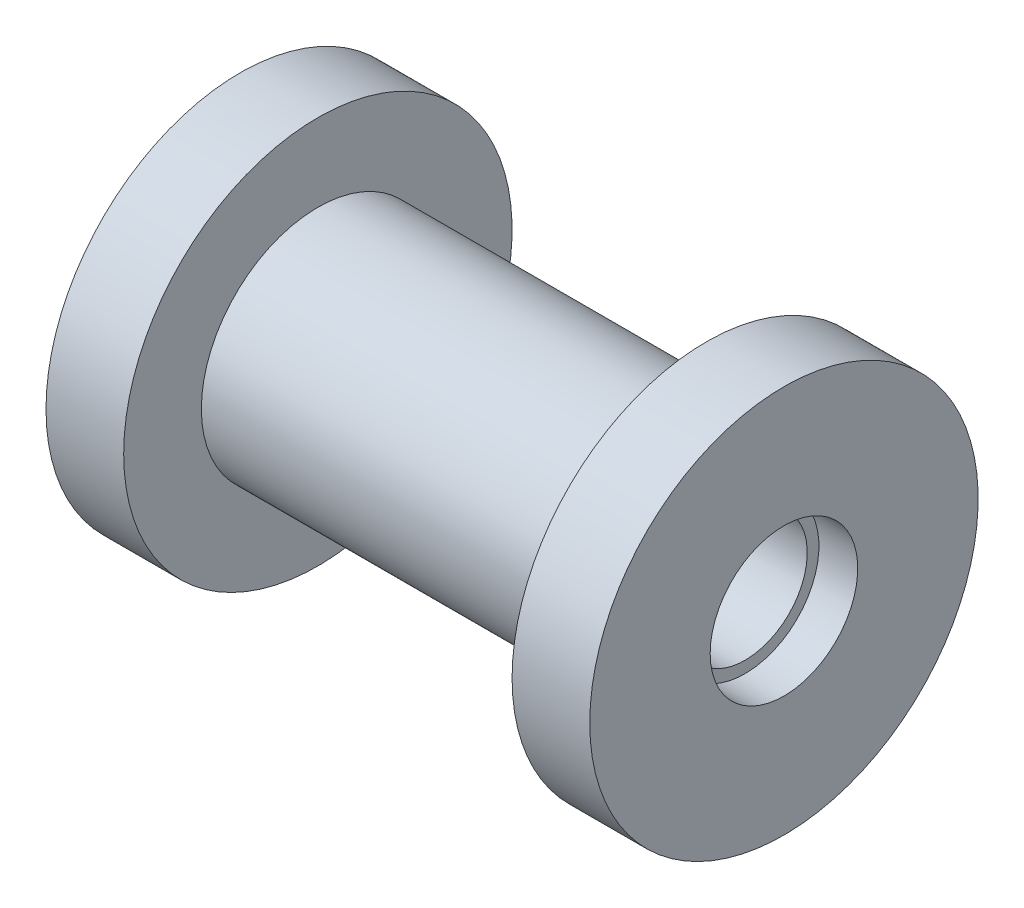
ISO-10303-21;
HEADER;
FILE_DESCRIPTION(('STEP AP214'),'2;1');
FILE_NAME('part.step','',(''),(''),'','','');
FILE_SCHEMA(('AUTOMOTIVE_DESIGN { 1 0 10303 214 1 1 1 1 }'));
ENDSEC;
DATA;
#1=APPLICATION_CONTEXT('core data for automotive mechanical design processes');
#2=APPLICATION_PROTOCOL_DEFINITION('international standard','automotive_design',2000,#1);
#3=PRODUCT_CONTEXT('',#1,'mechanical');
#4=PRODUCT('Part','Part','',(#3));
#5=PRODUCT_RELATED_PRODUCT_CATEGORY('part','',(#4));
#6=PRODUCT_DEFINITION_FORMATION('','',#4);
#7=PRODUCT_DEFINITION_CONTEXT('part definition',#1,'design');
#8=PRODUCT_DEFINITION('design','',#6,#7);
#9=PRODUCT_DEFINITION_SHAPE('','',#8);
#10=(LENGTH_UNIT() NAMED_UNIT(*) SI_UNIT(.MILLI.,.METRE.));
#11=(NAMED_UNIT(*) PLANE_ANGLE_UNIT() SI_UNIT($,.RADIAN.));
#12=(NAMED_UNIT(*) SI_UNIT($,.STERADIAN.) SOLID_ANGLE_UNIT());
#13=UNCERTAINTY_MEASURE_WITH_UNIT(LENGTH_MEASURE(1.E-05),#10,'distance_accuracy_value','');
#14=(GEOMETRIC_REPRESENTATION_CONTEXT(3) GLOBAL_UNCERTAINTY_ASSIGNED_CONTEXT((#13)) GLOBAL_UNIT_ASSIGNED_CONTEXT((#10,
#11,#12)) REPRESENTATION_CONTEXT('',''));
#15=CARTESIAN_POINT('',(0.,0.,0.));
#16=DIRECTION('',(0.,0.,1.));
#17=DIRECTION('',(1.,0.,0.));
#18=AXIS2_PLACEMENT_3D('',#15,#16,#17);
#19=CARTESIAN_POINT('',(5.00000000000001,0.,0.));
#20=DIRECTION('',(1.,0.,0.));
#21=DIRECTION('',(0.,0.,-1.));
#22=AXIS2_PLACEMENT_3D('',#19,#20,#21);
#23=PLANE('',#22);
#24=CARTESIAN_POINT('',(5.,0.,0.));
#25=DIRECTION('',(-1.,0.,0.));
#26=DIRECTION('',(0.,0.,1.));
#27=AXIS2_PLACEMENT_3D('',#24,#25,#26);
#28=CIRCLE('',#27,8.00000000000001);
#29=CARTESIAN_POINT('',(5.,0.,8.00000000000001));
#30=VERTEX_POINT('',#29);
#31=EDGE_CURVE('E10',#30,#30,#28,.T.);
#32=ORIENTED_EDGE('',*,*,#31,.F.);
#33=EDGE_LOOP('',(#32));
#34=FACE_BOUND('',#33,.T.);
#35=CARTESIAN_POINT('',(5.,0.,0.));
#36=DIRECTION('',(-1.,0.,0.));
#37=DIRECTION('',(0.,0.,1.));
#38=AXIS2_PLACEMENT_3D('',#35,#36,#37);
#39=CIRCLE('',#38,9.50000000000001);
#40=CARTESIAN_POINT('',(5.,0.,9.50000000000001));
#41=VERTEX_POINT('',#40);
#42=EDGE_CURVE('E73',#41,#41,#39,.T.);
#43=ORIENTED_EDGE('',*,*,#42,.T.);
#44=EDGE_LOOP('',(#43));
#45=FACE_BOUND('',#44,.T.);
#46=ADVANCED_FACE('F33',(#34,#45),#23,.F.);
#47=CARTESIAN_POINT('',(-69.3943757112314,0.,0.));
#48=DIRECTION('',(-1.,0.,0.));
#49=DIRECTION('',(0.,0.,1.));
#50=AXIS2_PLACEMENT_3D('',#47,#48,#49);
#51=CYLINDRICAL_SURFACE('',#50,8.00000000000001);
#52=CARTESIAN_POINT('',(65.,0.,0.));
#53=DIRECTION('',(-1.,0.,0.));
#54=DIRECTION('',(0.,0.,1.));
#55=AXIS2_PLACEMENT_3D('',#52,#53,#54);
#56=CIRCLE('',#55,8.);
#57=CARTESIAN_POINT('',(65.,0.,8.));
#58=VERTEX_POINT('',#57);
#59=EDGE_CURVE('E39',#58,#58,#56,.T.);
#60=ORIENTED_EDGE('',*,*,#59,.F.);
#61=EDGE_LOOP('',(#60));
#62=FACE_BOUND('',#61,.T.);
#63=ORIENTED_EDGE('',*,*,#31,.T.);
#64=EDGE_LOOP('',(#63));
#65=FACE_BOUND('',#64,.T.);
#66=ADVANCED_FACE('F96',(#62,#65),#51,.F.);
#67=CARTESIAN_POINT('',(65.,0.,0.));
#68=DIRECTION('',(1.,0.,0.));
#69=DIRECTION('',(0.,0.,-1.));
#70=AXIS2_PLACEMENT_3D('',#67,#68,#69);
#71=PLANE('',#70);
#72=ORIENTED_EDGE('',*,*,#59,.T.);
#73=EDGE_LOOP('',(#72));
#74=FACE_BOUND('',#73,.T.);
#75=CARTESIAN_POINT('',(65.,0.,0.));
#76=DIRECTION('',(-1.,0.,0.));
#77=DIRECTION('',(0.,0.,1.));
#78=AXIS2_PLACEMENT_3D('',#75,#76,#77);
#79=CIRCLE('',#78,9.5);
#80=CARTESIAN_POINT('',(65.,0.,9.5));
#81=VERTEX_POINT('',#80);
#82=EDGE_CURVE('E43',#81,#81,#79,.T.);
#83=ORIENTED_EDGE('',*,*,#82,.F.);
#84=EDGE_LOOP('',(#83));
#85=FACE_BOUND('',#84,.T.);
#86=ADVANCED_FACE('F101',(#74,#85),#71,.T.);
#87=CARTESIAN_POINT('',(-69.3943757112314,0.,0.));
#88=DIRECTION('',(-1.,0.,0.));
#89=DIRECTION('',(0.,0.,1.));
#90=AXIS2_PLACEMENT_3D('',#87,#88,#89);
#91=CYLINDRICAL_SURFACE('',#90,9.5);
#92=ORIENTED_EDGE('',*,*,#82,.T.);
#93=EDGE_LOOP('',(#92));
#94=FACE_BOUND('',#93,.T.);
#95=CARTESIAN_POINT('',(70.,0.,0.));
#96=DIRECTION('',(-1.,0.,0.));
#97=DIRECTION('',(0.,0.,1.));
#98=AXIS2_PLACEMENT_3D('',#95,#96,#97);
#99=CIRCLE('',#98,9.5);
#100=CARTESIAN_POINT('',(70.,0.,9.5));
#101=VERTEX_POINT('',#100);
#102=EDGE_CURVE('E47',#101,#101,#99,.T.);
#103=ORIENTED_EDGE('',*,*,#102,.F.);
#104=EDGE_LOOP('',(#103));
#105=FACE_BOUND('',#104,.T.);
#106=ADVANCED_FACE('F106',(#94,#105),#91,.F.);
#107=CARTESIAN_POINT('',(70.,0.,0.));
#108=DIRECTION('',(1.,0.,0.));
#109=DIRECTION('',(0.,0.,-1.));
#110=AXIS2_PLACEMENT_3D('',#107,#108,#109);
#111=PLANE('',#110);
#112=ORIENTED_EDGE('',*,*,#102,.T.);
#113=EDGE_LOOP('',(#112));
#114=FACE_BOUND('',#113,.T.);
#115=CARTESIAN_POINT('',(70.,0.,0.));
#116=DIRECTION('',(-1.,0.,0.));
#117=DIRECTION('',(0.,0.,1.));
#118=AXIS2_PLACEMENT_3D('',#115,#116,#117);
#119=CIRCLE('',#118,25.);
#120=CARTESIAN_POINT('',(70.,0.,25.));
#121=VERTEX_POINT('',#120);
#122=EDGE_CURVE('E52',#121,#121,#119,.T.);
#123=ORIENTED_EDGE('',*,*,#122,.F.);
#124=EDGE_LOOP('',(#123));
#125=FACE_BOUND('',#124,.T.);
#126=ADVANCED_FACE('F111',(#114,#125),#111,.T.);
#127=CARTESIAN_POINT('',(-69.3943757112314,0.,0.));
#128=DIRECTION('',(-1.,0.,0.));
#129=DIRECTION('',(0.,0.,1.));
#130=AXIS2_PLACEMENT_3D('',#127,#128,#129);
#131=CYLINDRICAL_SURFACE('',#130,25.);
#132=ORIENTED_EDGE('',*,*,#122,.T.);
#133=EDGE_LOOP('',(#132));
#134=FACE_BOUND('',#133,.T.);
#135=CARTESIAN_POINT('',(60.,0.,0.));
#136=DIRECTION('',(-1.,0.,0.));
#137=DIRECTION('',(0.,0.,1.));
#138=AXIS2_PLACEMENT_3D('',#135,#136,#137);
#139=CIRCLE('',#138,25.);
#140=CARTESIAN_POINT('',(60.,0.,25.));
#141=VERTEX_POINT('',#140);
#142=EDGE_CURVE('E55',#141,#141,#139,.T.);
#143=ORIENTED_EDGE('',*,*,#142,.F.);
#144=EDGE_LOOP('',(#143));
#145=FACE_BOUND('',#144,.T.);
#146=ADVANCED_FACE('F115',(#134,#145),#131,.T.);
#147=CARTESIAN_POINT('',(60.,0.,0.));
#148=DIRECTION('',(-1.,0.,0.));
#149=DIRECTION('',(0.,0.,1.));
#150=AXIS2_PLACEMENT_3D('',#147,#148,#149);
#151=PLANE('',#150);
#152=ORIENTED_EDGE('',*,*,#142,.T.);
#153=EDGE_LOOP('',(#152));
#154=FACE_BOUND('',#153,.T.);
#155=CARTESIAN_POINT('',(60.,0.,0.));
#156=DIRECTION('',(-1.,0.,0.));
#157=DIRECTION('',(0.,0.,1.));
#158=AXIS2_PLACEMENT_3D('',#155,#156,#157);
#159=CIRCLE('',#158,15.);
#160=CARTESIAN_POINT('',(60.,0.,15.));
#161=VERTEX_POINT('',#160);
#162=EDGE_CURVE('E58',#161,#161,#159,.T.);
#163=ORIENTED_EDGE('',*,*,#162,.F.);
#164=EDGE_LOOP('',(#163));
#165=FACE_BOUND('',#164,.T.);
#166=ADVANCED_FACE('F119',(#154,#165),#151,.T.);
#167=CARTESIAN_POINT('',(-69.3943757112314,0.,0.));
#168=DIRECTION('',(-1.,0.,0.));
#169=DIRECTION('',(0.,0.,1.));
#170=AXIS2_PLACEMENT_3D('',#167,#168,#169);
#171=CYLINDRICAL_SURFACE('',#170,15.);
#172=ORIENTED_EDGE('',*,*,#162,.T.);
#173=EDGE_LOOP('',(#172));
#174=FACE_BOUND('',#173,.T.);
#175=CARTESIAN_POINT('',(10.,0.,0.));
#176=DIRECTION('',(-1.,0.,0.));
#177=DIRECTION('',(0.,0.,1.));
#178=AXIS2_PLACEMENT_3D('',#175,#176,#177);
#179=CIRCLE('',#178,15.);
#180=CARTESIAN_POINT('',(10.,0.,15.));
#181=VERTEX_POINT('',#180);
#182=EDGE_CURVE('E61',#181,#181,#179,.T.);
#183=ORIENTED_EDGE('',*,*,#182,.F.);
#184=EDGE_LOOP('',(#183));
#185=FACE_BOUND('',#184,.T.);
#186=ADVANCED_FACE('F123',(#174,#185),#171,.T.);
#187=CARTESIAN_POINT('',(10.,0.,0.));
#188=DIRECTION('',(1.,0.,0.));
#189=DIRECTION('',(0.,0.,-1.));
#190=AXIS2_PLACEMENT_3D('',#187,#188,#189);
#191=PLANE('',#190);
#192=ORIENTED_EDGE('',*,*,#182,.T.);
#193=EDGE_LOOP('',(#192));
#194=FACE_BOUND('',#193,.T.);
#195=CARTESIAN_POINT('',(10.,0.,0.));
#196=DIRECTION('',(-1.,0.,0.));
#197=DIRECTION('',(0.,0.,1.));
#198=AXIS2_PLACEMENT_3D('',#195,#196,#197);
#199=CIRCLE('',#198,25.);
#200=CARTESIAN_POINT('',(10.,0.,25.));
#201=VERTEX_POINT('',#200);
#202=EDGE_CURVE('E64',#201,#201,#199,.T.);
#203=ORIENTED_EDGE('',*,*,#202,.F.);
#204=EDGE_LOOP('',(#203));
#205=FACE_BOUND('',#204,.T.);
#206=ADVANCED_FACE('F92',(#194,#205),#191,.T.);
#207=CARTESIAN_POINT('',(-69.3943757112314,0.,0.));
#208=DIRECTION('',(-1.,0.,0.));
#209=DIRECTION('',(0.,0.,1.));
#210=AXIS2_PLACEMENT_3D('',#207,#208,#209);
#211=CYLINDRICAL_SURFACE('',#210,25.);
#212=ORIENTED_EDGE('',*,*,#202,.T.);
#213=EDGE_LOOP('',(#212));
#214=FACE_BOUND('',#213,.T.);
#215=CARTESIAN_POINT('',(0.,0.,0.));
#216=DIRECTION('',(-1.,0.,0.));
#217=DIRECTION('',(0.,0.,1.));
#218=AXIS2_PLACEMENT_3D('',#215,#216,#217);
#219=CIRCLE('',#218,25.);
#220=CARTESIAN_POINT('',(0.,0.,25.));
#221=VERTEX_POINT('',#220);
#222=EDGE_CURVE('E67',#221,#221,#219,.T.);
#223=ORIENTED_EDGE('',*,*,#222,.F.);
#224=EDGE_LOOP('',(#223));
#225=FACE_BOUND('',#224,.T.);
#226=ADVANCED_FACE('F86',(#214,#225),#211,.T.);
#227=CARTESIAN_POINT('',(0.,0.,0.));
#228=DIRECTION('',(-1.,0.,0.));
#229=DIRECTION('',(0.,0.,1.));
#230=AXIS2_PLACEMENT_3D('',#227,#228,#229);
#231=PLANE('',#230);
#232=ORIENTED_EDGE('',*,*,#222,.T.);
#233=EDGE_LOOP('',(#232));
#234=FACE_BOUND('',#233,.T.);
#235=CARTESIAN_POINT('',(0.,0.,0.));
#236=DIRECTION('',(-1.,0.,0.));
#237=DIRECTION('',(0.,0.,1.));
#238=AXIS2_PLACEMENT_3D('',#235,#236,#237);
#239=CIRCLE('',#238,9.50000000000001);
#240=CARTESIAN_POINT('',(0.,0.,9.50000000000001));
#241=VERTEX_POINT('',#240);
#242=EDGE_CURVE('E70',#241,#241,#239,.T.);
#243=ORIENTED_EDGE('',*,*,#242,.F.);
#244=EDGE_LOOP('',(#243));
#245=FACE_BOUND('',#244,.T.);
#246=ADVANCED_FACE('F81',(#234,#245),#231,.T.);
#247=CARTESIAN_POINT('',(-69.3943757112314,0.,0.));
#248=DIRECTION('',(-1.,0.,0.));
#249=DIRECTION('',(0.,0.,1.));
#250=AXIS2_PLACEMENT_3D('',#247,#248,#249);
#251=CYLINDRICAL_SURFACE('',#250,9.50000000000001);
#252=ORIENTED_EDGE('',*,*,#42,.F.);
#253=EDGE_LOOP('',(#252));
#254=FACE_BOUND('',#253,.T.);
#255=ORIENTED_EDGE('',*,*,#242,.T.);
#256=EDGE_LOOP('',(#255));
#257=FACE_BOUND('',#256,.T.);
#258=ADVANCED_FACE('F78',(#254,#257),#251,.F.);
#259=CLOSED_SHELL('',(#46,#66,#86,#106,#126,#146,#166,#186,#206,#226,#246,#258));
#260=MANIFOLD_SOLID_BREP('B2',#259);
#261=ADVANCED_BREP_SHAPE_REPRESENTATION('',(#18,#260),#14);
#262=SHAPE_DEFINITION_REPRESENTATION(#9,#261);
ENDSEC;
END-ISO-10303-21;
